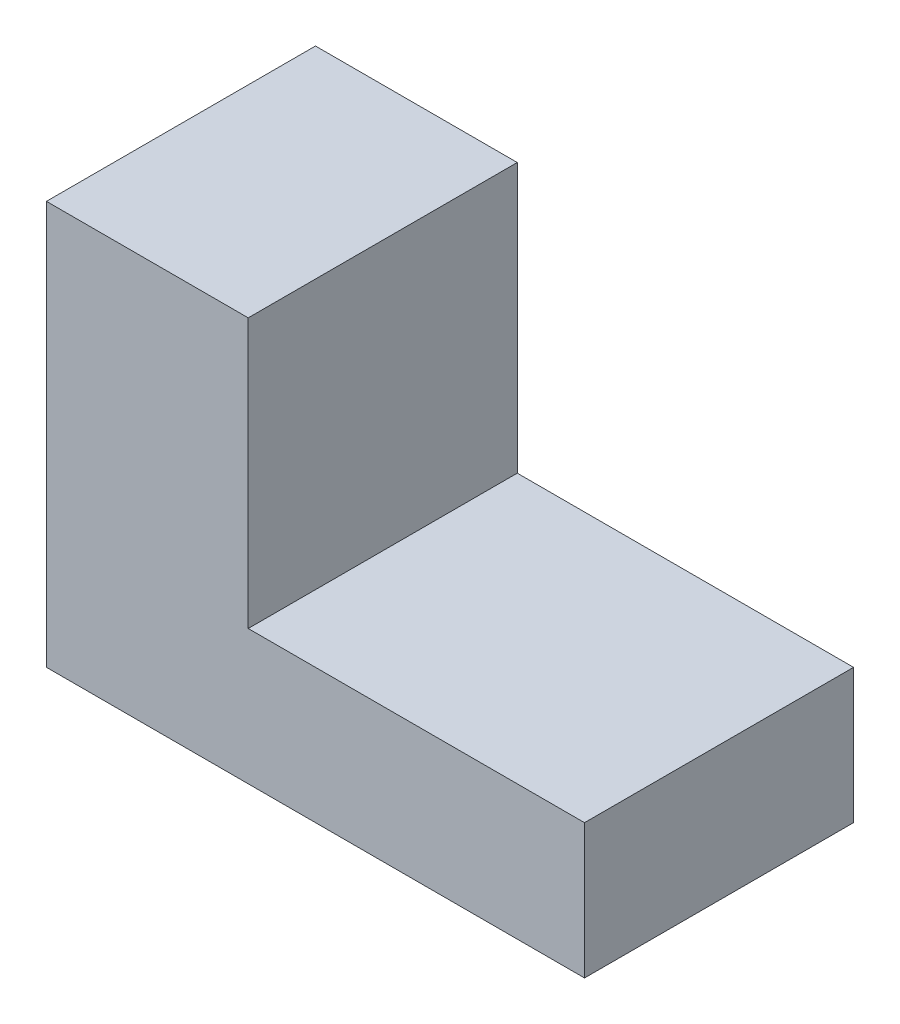
ISO-10303-21;
HEADER;
FILE_DESCRIPTION(('STEP AP214'),'2;1');
FILE_NAME('part.step','',(''),(''),'','','');
FILE_SCHEMA(('AUTOMOTIVE_DESIGN { 1 0 10303 214 1 1 1 1 }'));
ENDSEC;
DATA;
#1=APPLICATION_CONTEXT('core data for automotive mechanical design processes');
#2=APPLICATION_PROTOCOL_DEFINITION('international standard','automotive_design',2000,#1);
#3=PRODUCT_CONTEXT('',#1,'mechanical');
#4=PRODUCT('Part','Part','',(#3));
#5=PRODUCT_RELATED_PRODUCT_CATEGORY('part','',(#4));
#6=PRODUCT_DEFINITION_FORMATION('','',#4);
#7=PRODUCT_DEFINITION_CONTEXT('part definition',#1,'design');
#8=PRODUCT_DEFINITION('design','',#6,#7);
#9=PRODUCT_DEFINITION_SHAPE('','',#8);
#10=(LENGTH_UNIT() NAMED_UNIT(*) SI_UNIT(.MILLI.,.METRE.));
#11=(NAMED_UNIT(*) PLANE_ANGLE_UNIT() SI_UNIT($,.RADIAN.));
#12=(NAMED_UNIT(*) SI_UNIT($,.STERADIAN.) SOLID_ANGLE_UNIT());
#13=UNCERTAINTY_MEASURE_WITH_UNIT(LENGTH_MEASURE(1.E-05),#10,'distance_accuracy_value','');
#14=(GEOMETRIC_REPRESENTATION_CONTEXT(3) GLOBAL_UNCERTAINTY_ASSIGNED_CONTEXT((#13)) GLOBAL_UNIT_ASSIGNED_CONTEXT((#10,
#11,#12)) REPRESENTATION_CONTEXT('',''));
#15=CARTESIAN_POINT('',(0.,0.,0.));
#16=DIRECTION('',(0.,0.,1.));
#17=DIRECTION('',(1.,0.,0.));
#18=AXIS2_PLACEMENT_3D('',#15,#16,#17);
#19=CARTESIAN_POINT('',(0.,30.,20.));
#20=DIRECTION('',(1.,0.,0.));
#21=DIRECTION('',(0.,0.,-1.));
#22=AXIS2_PLACEMENT_3D('',#19,#20,#21);
#23=PLANE('',#22);
#24=DIRECTION('',(0.,-1.,0.));
#25=VECTOR('',#24,1.);
#26=CARTESIAN_POINT('',(0.,30.,0.));
#27=LINE('',#26,#25);
#28=CARTESIAN_POINT('',(0.,30.,0.));
#29=VERTEX_POINT('',#28);
#30=CARTESIAN_POINT('',(0.,0.,0.));
#31=VERTEX_POINT('',#30);
#32=EDGE_CURVE('E127',#29,#31,#27,.T.);
#33=ORIENTED_EDGE('',*,*,#32,.T.);
#34=DIRECTION('',(0.,0.,-1.));
#35=VECTOR('',#34,1.);
#36=CARTESIAN_POINT('',(0.,0.,20.));
#37=LINE('',#36,#35);
#38=CARTESIAN_POINT('',(0.,0.,20.));
#39=VERTEX_POINT('',#38);
#40=EDGE_CURVE('E11',#39,#31,#37,.T.);
#41=ORIENTED_EDGE('',*,*,#40,.F.);
#42=DIRECTION('',(0.,-1.,0.));
#43=VECTOR('',#42,1.);
#44=CARTESIAN_POINT('',(0.,30.,20.));
#45=LINE('',#44,#43);
#46=CARTESIAN_POINT('',(0.,30.,20.));
#47=VERTEX_POINT('',#46);
#48=EDGE_CURVE('E137',#47,#39,#45,.T.);
#49=ORIENTED_EDGE('',*,*,#48,.F.);
#50=DIRECTION('',(0.,0.,-1.));
#51=VECTOR('',#50,1.);
#52=CARTESIAN_POINT('',(0.,30.,20.));
#53=LINE('',#52,#51);
#54=EDGE_CURVE('E123',#47,#29,#53,.T.);
#55=ORIENTED_EDGE('',*,*,#54,.T.);
#56=EDGE_LOOP('',(#33,#41,#49,#55));
#57=FACE_BOUND('',#56,.T.);
#58=ADVANCED_FACE('F43',(#57),#23,.F.);
#59=CARTESIAN_POINT('',(0.,0.,20.));
#60=DIRECTION('',(0.,1.,0.));
#61=DIRECTION('',(0.,0.,1.));
#62=AXIS2_PLACEMENT_3D('',#59,#60,#61);
#63=PLANE('',#62);
#64=DIRECTION('',(1.,0.,0.));
#65=VECTOR('',#64,1.);
#66=CARTESIAN_POINT('',(0.,0.,0.));
#67=LINE('',#66,#65);
#68=CARTESIAN_POINT('',(40.,0.,0.));
#69=VERTEX_POINT('',#68);
#70=EDGE_CURVE('E130',#31,#69,#67,.T.);
#71=ORIENTED_EDGE('',*,*,#70,.T.);
#72=DIRECTION('',(0.,0.,-1.));
#73=VECTOR('',#72,1.);
#74=CARTESIAN_POINT('',(40.,0.,20.));
#75=LINE('',#74,#73);
#76=CARTESIAN_POINT('',(40.,0.,20.));
#77=VERTEX_POINT('',#76);
#78=EDGE_CURVE('E51',#77,#69,#75,.T.);
#79=ORIENTED_EDGE('',*,*,#78,.F.);
#80=DIRECTION('',(1.,0.,0.));
#81=VECTOR('',#80,1.);
#82=CARTESIAN_POINT('',(0.,0.,20.));
#83=LINE('',#82,#81);
#84=EDGE_CURVE('E96',#39,#77,#83,.T.);
#85=ORIENTED_EDGE('',*,*,#84,.F.);
#86=ORIENTED_EDGE('',*,*,#40,.T.);
#87=EDGE_LOOP('',(#71,#79,#85,#86));
#88=FACE_BOUND('',#87,.T.);
#89=ADVANCED_FACE('F161',(#88),#63,.F.);
#90=CARTESIAN_POINT('',(40.,0.,20.));
#91=DIRECTION('',(-1.,0.,0.));
#92=DIRECTION('',(0.,0.,1.));
#93=AXIS2_PLACEMENT_3D('',#90,#91,#92);
#94=PLANE('',#93);
#95=DIRECTION('',(0.,1.,0.));
#96=VECTOR('',#95,1.);
#97=CARTESIAN_POINT('',(40.,0.,0.));
#98=LINE('',#97,#96);
#99=CARTESIAN_POINT('',(40.,10.,0.));
#100=VERTEX_POINT('',#99);
#101=EDGE_CURVE('E132',#69,#100,#98,.T.);
#102=ORIENTED_EDGE('',*,*,#101,.T.);
#103=DIRECTION('',(0.,0.,-1.));
#104=VECTOR('',#103,1.);
#105=CARTESIAN_POINT('',(40.,10.,20.));
#106=LINE('',#105,#104);
#107=CARTESIAN_POINT('',(40.,10.,20.));
#108=VERTEX_POINT('',#107);
#109=EDGE_CURVE('E118',#108,#100,#106,.T.);
#110=ORIENTED_EDGE('',*,*,#109,.F.);
#111=DIRECTION('',(0.,1.,0.));
#112=VECTOR('',#111,1.);
#113=CARTESIAN_POINT('',(40.,0.,20.));
#114=LINE('',#113,#112);
#115=EDGE_CURVE('E109',#77,#108,#114,.T.);
#116=ORIENTED_EDGE('',*,*,#115,.F.);
#117=ORIENTED_EDGE('',*,*,#78,.T.);
#118=EDGE_LOOP('',(#102,#110,#116,#117));
#119=FACE_BOUND('',#118,.T.);
#120=ADVANCED_FACE('F143',(#119),#94,.F.);
#121=CARTESIAN_POINT('',(40.,10.,20.));
#122=DIRECTION('',(0.,-1.,0.));
#123=DIRECTION('',(0.,0.,-1.));
#124=AXIS2_PLACEMENT_3D('',#121,#122,#123);
#125=PLANE('',#124);
#126=DIRECTION('',(-1.,0.,0.));
#127=VECTOR('',#126,1.);
#128=CARTESIAN_POINT('',(40.,10.,0.));
#129=LINE('',#128,#127);
#130=CARTESIAN_POINT('',(15.,10.,0.));
#131=VERTEX_POINT('',#130);
#132=EDGE_CURVE('E117',#100,#131,#129,.T.);
#133=ORIENTED_EDGE('',*,*,#132,.T.);
#134=DIRECTION('',(0.,0.,-1.));
#135=VECTOR('',#134,1.);
#136=CARTESIAN_POINT('',(15.,10.,20.));
#137=LINE('',#136,#135);
#138=CARTESIAN_POINT('',(15.,10.,20.));
#139=VERTEX_POINT('',#138);
#140=EDGE_CURVE('E114',#139,#131,#137,.T.);
#141=ORIENTED_EDGE('',*,*,#140,.F.);
#142=DIRECTION('',(-1.,0.,0.));
#143=VECTOR('',#142,1.);
#144=CARTESIAN_POINT('',(40.,10.,20.));
#145=LINE('',#144,#143);
#146=EDGE_CURVE('E103',#108,#139,#145,.T.);
#147=ORIENTED_EDGE('',*,*,#146,.F.);
#148=ORIENTED_EDGE('',*,*,#109,.T.);
#149=EDGE_LOOP('',(#133,#141,#147,#148));
#150=FACE_BOUND('',#149,.T.);
#151=ADVANCED_FACE('F115',(#150),#125,.F.);
#152=CARTESIAN_POINT('',(15.,10.,20.));
#153=DIRECTION('',(-1.,0.,0.));
#154=DIRECTION('',(0.,0.,1.));
#155=AXIS2_PLACEMENT_3D('',#152,#153,#154);
#156=PLANE('',#155);
#157=DIRECTION('',(0.,1.,0.));
#158=VECTOR('',#157,1.);
#159=CARTESIAN_POINT('',(15.,10.,0.));
#160=LINE('',#159,#158);
#161=CARTESIAN_POINT('',(15.,30.,0.));
#162=VERTEX_POINT('',#161);
#163=EDGE_CURVE('E82',#131,#162,#160,.T.);
#164=ORIENTED_EDGE('',*,*,#163,.T.);
#165=DIRECTION('',(0.,0.,-1.));
#166=VECTOR('',#165,1.);
#167=CARTESIAN_POINT('',(15.,30.,20.));
#168=LINE('',#167,#166);
#169=CARTESIAN_POINT('',(15.,30.,20.));
#170=VERTEX_POINT('',#169);
#171=EDGE_CURVE('E119',#170,#162,#168,.T.);
#172=ORIENTED_EDGE('',*,*,#171,.F.);
#173=DIRECTION('',(0.,1.,0.));
#174=VECTOR('',#173,1.);
#175=CARTESIAN_POINT('',(15.,10.,20.));
#176=LINE('',#175,#174);
#177=EDGE_CURVE('E107',#139,#170,#176,.T.);
#178=ORIENTED_EDGE('',*,*,#177,.F.);
#179=ORIENTED_EDGE('',*,*,#140,.T.);
#180=EDGE_LOOP('',(#164,#172,#178,#179));
#181=FACE_BOUND('',#180,.T.);
#182=ADVANCED_FACE('F121',(#181),#156,.F.);
#183=CARTESIAN_POINT('',(15.,30.,20.));
#184=DIRECTION('',(0.,-1.,0.));
#185=DIRECTION('',(0.,0.,-1.));
#186=AXIS2_PLACEMENT_3D('',#183,#184,#185);
#187=PLANE('',#186);
#188=DIRECTION('',(-1.,0.,0.));
#189=VECTOR('',#188,1.);
#190=CARTESIAN_POINT('',(15.,30.,0.));
#191=LINE('',#190,#189);
#192=EDGE_CURVE('E88',#162,#29,#191,.T.);
#193=ORIENTED_EDGE('',*,*,#192,.T.);
#194=ORIENTED_EDGE('',*,*,#54,.F.);
#195=DIRECTION('',(-1.,0.,0.));
#196=VECTOR('',#195,1.);
#197=CARTESIAN_POINT('',(15.,30.,20.));
#198=LINE('',#197,#196);
#199=EDGE_CURVE('E59',#170,#47,#198,.T.);
#200=ORIENTED_EDGE('',*,*,#199,.F.);
#201=ORIENTED_EDGE('',*,*,#171,.T.);
#202=EDGE_LOOP('',(#193,#194,#200,#201));
#203=FACE_BOUND('',#202,.T.);
#204=ADVANCED_FACE('F150',(#203),#187,.F.);
#205=CARTESIAN_POINT('',(0.,0.,20.));
#206=DIRECTION('',(0.,0.,1.));
#207=DIRECTION('',(1.,0.,0.));
#208=AXIS2_PLACEMENT_3D('',#205,#206,#207);
#209=PLANE('',#208);
#210=ORIENTED_EDGE('',*,*,#48,.T.);
#211=ORIENTED_EDGE('',*,*,#84,.T.);
#212=ORIENTED_EDGE('',*,*,#115,.T.);
#213=ORIENTED_EDGE('',*,*,#146,.T.);
#214=ORIENTED_EDGE('',*,*,#177,.T.);
#215=ORIENTED_EDGE('',*,*,#199,.T.);
#216=EDGE_LOOP('',(#210,#211,#212,#213,#214,#215));
#217=FACE_BOUND('',#216,.T.);
#218=ADVANCED_FACE('F105',(#217),#209,.T.);
#219=CARTESIAN_POINT('',(0.,0.,0.));
#220=DIRECTION('',(0.,0.,1.));
#221=DIRECTION('',(1.,0.,0.));
#222=AXIS2_PLACEMENT_3D('',#219,#220,#221);
#223=PLANE('',#222);
#224=ORIENTED_EDGE('',*,*,#32,.F.);
#225=ORIENTED_EDGE('',*,*,#192,.F.);
#226=ORIENTED_EDGE('',*,*,#163,.F.);
#227=ORIENTED_EDGE('',*,*,#132,.F.);
#228=ORIENTED_EDGE('',*,*,#101,.F.);
#229=ORIENTED_EDGE('',*,*,#70,.F.);
#230=EDGE_LOOP('',(#224,#225,#226,#227,#228,#229));
#231=FACE_BOUND('',#230,.T.);
#232=ADVANCED_FACE('F146',(#231),#223,.F.);
#233=CLOSED_SHELL('',(#58,#89,#120,#151,#182,#204,#218,#232));
#234=MANIFOLD_SOLID_BREP('B2',#233);
#235=ADVANCED_BREP_SHAPE_REPRESENTATION('',(#18,#234),#14);
#236=SHAPE_DEFINITION_REPRESENTATION(#9,#235);
ENDSEC;
END-ISO-10303-21;
